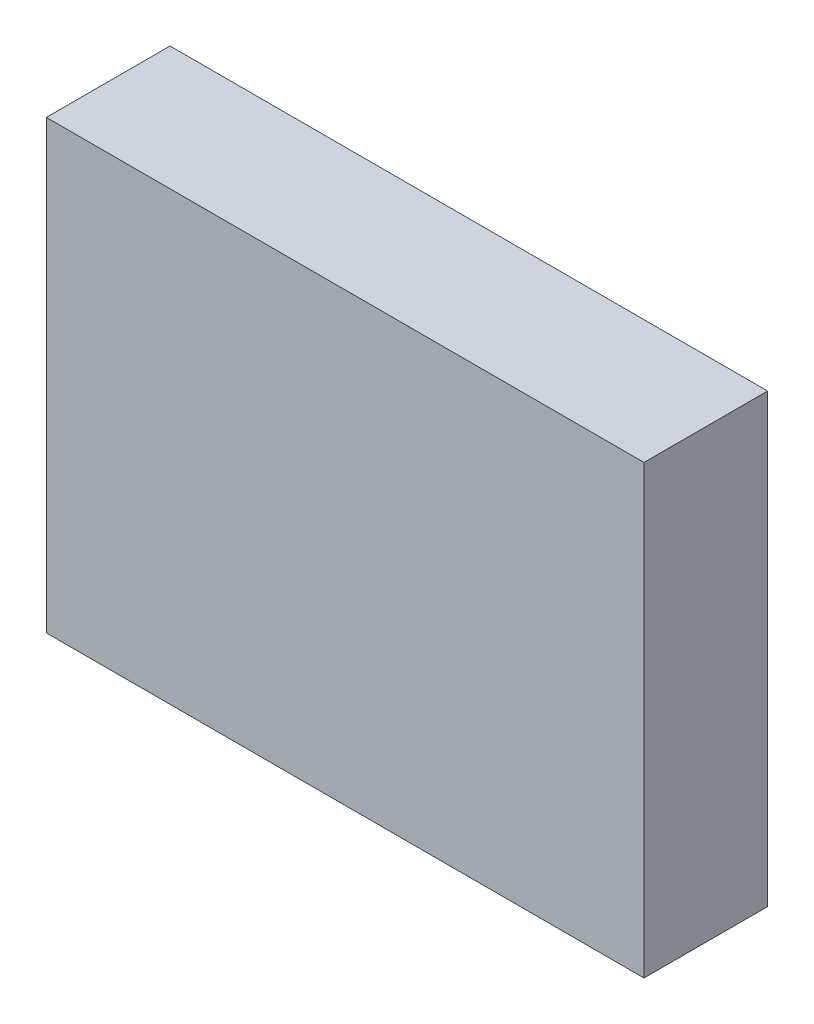
ISO-10303-21;
HEADER;
FILE_DESCRIPTION(('STEP AP214'),'2;1');
FILE_NAME('part.step','',(''),(''),'','','');
FILE_SCHEMA(('AUTOMOTIVE_DESIGN { 1 0 10303 214 1 1 1 1 }'));
ENDSEC;
DATA;
#1=APPLICATION_CONTEXT('core data for automotive mechanical design processes');
#2=APPLICATION_PROTOCOL_DEFINITION('international standard','automotive_design',2000,#1);
#3=PRODUCT_CONTEXT('',#1,'mechanical');
#4=PRODUCT('Part','Part','',(#3));
#5=PRODUCT_RELATED_PRODUCT_CATEGORY('part','',(#4));
#6=PRODUCT_DEFINITION_FORMATION('','',#4);
#7=PRODUCT_DEFINITION_CONTEXT('part definition',#1,'design');
#8=PRODUCT_DEFINITION('design','',#6,#7);
#9=PRODUCT_DEFINITION_SHAPE('','',#8);
#10=(LENGTH_UNIT() NAMED_UNIT(*) SI_UNIT(.MILLI.,.METRE.));
#11=(NAMED_UNIT(*) PLANE_ANGLE_UNIT() SI_UNIT($,.RADIAN.));
#12=(NAMED_UNIT(*) SI_UNIT($,.STERADIAN.) SOLID_ANGLE_UNIT());
#13=UNCERTAINTY_MEASURE_WITH_UNIT(LENGTH_MEASURE(1.E-05),#10,'distance_accuracy_value','');
#14=(GEOMETRIC_REPRESENTATION_CONTEXT(3) GLOBAL_UNCERTAINTY_ASSIGNED_CONTEXT((#13)) GLOBAL_UNIT_ASSIGNED_CONTEXT((#10,
#11,#12)) REPRESENTATION_CONTEXT('',''));
#15=CARTESIAN_POINT('',(0.,0.,0.));
#16=DIRECTION('',(0.,0.,1.));
#17=DIRECTION('',(1.,0.,0.));
#18=AXIS2_PLACEMENT_3D('',#15,#16,#17);
#19=CARTESIAN_POINT('',(43.5,32.5,18.));
#20=DIRECTION('',(-1.,0.,0.));
#21=DIRECTION('',(0.,-1.,0.));
#22=AXIS2_PLACEMENT_3D('',#19,#20,#21);
#23=PLANE('',#22);
#24=DIRECTION('',(0.,1.,0.));
#25=VECTOR('',#24,1.);
#26=CARTESIAN_POINT('',(43.5,32.5,0.));
#27=LINE('',#26,#25);
#28=CARTESIAN_POINT('',(43.5,-32.5,0.));
#29=VERTEX_POINT('',#28);
#30=CARTESIAN_POINT('',(43.5,32.5,0.));
#31=VERTEX_POINT('',#30);
#32=EDGE_CURVE('E104',#29,#31,#27,.T.);
#33=ORIENTED_EDGE('',*,*,#32,.T.);
#34=DIRECTION('',(0.,0.,-1.));
#35=VECTOR('',#34,1.);
#36=CARTESIAN_POINT('',(43.5,32.5,18.));
#37=LINE('',#36,#35);
#38=CARTESIAN_POINT('',(43.5,32.5,18.));
#39=VERTEX_POINT('',#38);
#40=EDGE_CURVE('E11',#39,#31,#37,.T.);
#41=ORIENTED_EDGE('',*,*,#40,.F.);
#42=DIRECTION('',(0.,1.,0.));
#43=VECTOR('',#42,1.);
#44=CARTESIAN_POINT('',(43.5,32.5,18.));
#45=LINE('',#44,#43);
#46=CARTESIAN_POINT('',(43.5,-32.5,18.));
#47=VERTEX_POINT('',#46);
#48=EDGE_CURVE('E92',#47,#39,#45,.T.);
#49=ORIENTED_EDGE('',*,*,#48,.F.);
#50=DIRECTION('',(0.,0.,-1.));
#51=VECTOR('',#50,1.);
#52=CARTESIAN_POINT('',(43.5,-32.5,18.));
#53=LINE('',#52,#51);
#54=EDGE_CURVE('E100',#47,#29,#53,.T.);
#55=ORIENTED_EDGE('',*,*,#54,.T.);
#56=EDGE_LOOP('',(#33,#41,#49,#55));
#57=FACE_BOUND('',#56,.T.);
#58=ADVANCED_FACE('F41',(#57),#23,.F.);
#59=CARTESIAN_POINT('',(-43.5,32.5,18.));
#60=DIRECTION('',(0.,-1.,0.));
#61=DIRECTION('',(0.,0.,-1.));
#62=AXIS2_PLACEMENT_3D('',#59,#60,#61);
#63=PLANE('',#62);
#64=DIRECTION('',(-1.,0.,0.));
#65=VECTOR('',#64,1.);
#66=CARTESIAN_POINT('',(-43.5,32.5,0.));
#67=LINE('',#66,#65);
#68=CARTESIAN_POINT('',(-43.5,32.5,0.));
#69=VERTEX_POINT('',#68);
#70=EDGE_CURVE('E96',#31,#69,#67,.T.);
#71=ORIENTED_EDGE('',*,*,#70,.T.);
#72=DIRECTION('',(0.,0.,-1.));
#73=VECTOR('',#72,1.);
#74=CARTESIAN_POINT('',(-43.5,32.5,18.));
#75=LINE('',#74,#73);
#76=CARTESIAN_POINT('',(-43.5,32.5,18.));
#77=VERTEX_POINT('',#76);
#78=EDGE_CURVE('E49',#77,#69,#75,.T.);
#79=ORIENTED_EDGE('',*,*,#78,.F.);
#80=DIRECTION('',(-1.,0.,0.));
#81=VECTOR('',#80,1.);
#82=CARTESIAN_POINT('',(-43.5,32.5,18.));
#83=LINE('',#82,#81);
#84=EDGE_CURVE('E87',#39,#77,#83,.T.);
#85=ORIENTED_EDGE('',*,*,#84,.F.);
#86=ORIENTED_EDGE('',*,*,#40,.T.);
#87=EDGE_LOOP('',(#71,#79,#85,#86));
#88=FACE_BOUND('',#87,.T.);
#89=ADVANCED_FACE('F95',(#88),#63,.F.);
#90=CARTESIAN_POINT('',(-43.5,32.5,18.));
#91=DIRECTION('',(1.,0.,0.));
#92=DIRECTION('',(0.,1.,0.));
#93=AXIS2_PLACEMENT_3D('',#90,#91,#92);
#94=PLANE('',#93);
#95=DIRECTION('',(0.,-1.,0.));
#96=VECTOR('',#95,1.);
#97=CARTESIAN_POINT('',(-43.5,32.5,0.));
#98=LINE('',#97,#96);
#99=CARTESIAN_POINT('',(-43.5,-32.5,0.));
#100=VERTEX_POINT('',#99);
#101=EDGE_CURVE('E74',#69,#100,#98,.T.);
#102=ORIENTED_EDGE('',*,*,#101,.T.);
#103=DIRECTION('',(0.,0.,-1.));
#104=VECTOR('',#103,1.);
#105=CARTESIAN_POINT('',(-43.5,-32.5,18.));
#106=LINE('',#105,#104);
#107=CARTESIAN_POINT('',(-43.5,-32.5,18.));
#108=VERTEX_POINT('',#107);
#109=EDGE_CURVE('E97',#108,#100,#106,.T.);
#110=ORIENTED_EDGE('',*,*,#109,.F.);
#111=DIRECTION('',(0.,-1.,0.));
#112=VECTOR('',#111,1.);
#113=CARTESIAN_POINT('',(-43.5,32.5,18.));
#114=LINE('',#113,#112);
#115=EDGE_CURVE('E90',#77,#108,#114,.T.);
#116=ORIENTED_EDGE('',*,*,#115,.F.);
#117=ORIENTED_EDGE('',*,*,#78,.T.);
#118=EDGE_LOOP('',(#102,#110,#116,#117));
#119=FACE_BOUND('',#118,.T.);
#120=ADVANCED_FACE('F98',(#119),#94,.F.);
#121=CARTESIAN_POINT('',(-43.5,-32.5,18.));
#122=DIRECTION('',(0.,1.,0.));
#123=DIRECTION('',(0.,0.,1.));
#124=AXIS2_PLACEMENT_3D('',#121,#122,#123);
#125=PLANE('',#124);
#126=DIRECTION('',(1.,0.,0.));
#127=VECTOR('',#126,1.);
#128=CARTESIAN_POINT('',(-43.5,-32.5,0.));
#129=LINE('',#128,#127);
#130=EDGE_CURVE('E80',#100,#29,#129,.T.);
#131=ORIENTED_EDGE('',*,*,#130,.T.);
#132=ORIENTED_EDGE('',*,*,#54,.F.);
#133=DIRECTION('',(1.,0.,0.));
#134=VECTOR('',#133,1.);
#135=CARTESIAN_POINT('',(-43.5,-32.5,18.));
#136=LINE('',#135,#134);
#137=EDGE_CURVE('E57',#108,#47,#136,.T.);
#138=ORIENTED_EDGE('',*,*,#137,.F.);
#139=ORIENTED_EDGE('',*,*,#109,.T.);
#140=EDGE_LOOP('',(#131,#132,#138,#139));
#141=FACE_BOUND('',#140,.T.);
#142=ADVANCED_FACE('F111',(#141),#125,.F.);
#143=CARTESIAN_POINT('',(0.,0.,18.));
#144=DIRECTION('',(0.,0.,1.));
#145=DIRECTION('',(1.,0.,0.));
#146=AXIS2_PLACEMENT_3D('',#143,#144,#145);
#147=PLANE('',#146);
#148=ORIENTED_EDGE('',*,*,#48,.T.);
#149=ORIENTED_EDGE('',*,*,#84,.T.);
#150=ORIENTED_EDGE('',*,*,#115,.T.);
#151=ORIENTED_EDGE('',*,*,#137,.T.);
#152=EDGE_LOOP('',(#148,#149,#150,#151));
#153=FACE_BOUND('',#152,.T.);
#154=ADVANCED_FACE('F88',(#153),#147,.T.);
#155=CARTESIAN_POINT('',(0.,0.,0.));
#156=DIRECTION('',(0.,0.,1.));
#157=DIRECTION('',(1.,0.,0.));
#158=AXIS2_PLACEMENT_3D('',#155,#156,#157);
#159=PLANE('',#158);
#160=ORIENTED_EDGE('',*,*,#32,.F.);
#161=ORIENTED_EDGE('',*,*,#130,.F.);
#162=ORIENTED_EDGE('',*,*,#101,.F.);
#163=ORIENTED_EDGE('',*,*,#70,.F.);
#164=EDGE_LOOP('',(#160,#161,#162,#163));
#165=FACE_BOUND('',#164,.T.);
#166=ADVANCED_FACE('F114',(#165),#159,.F.);
#167=CLOSED_SHELL('',(#58,#89,#120,#142,#154,#166));
#168=MANIFOLD_SOLID_BREP('B2',#167);
#169=ADVANCED_BREP_SHAPE_REPRESENTATION('',(#18,#168),#14);
#170=SHAPE_DEFINITION_REPRESENTATION(#9,#169);
ENDSEC;
END-ISO-10303-21;
